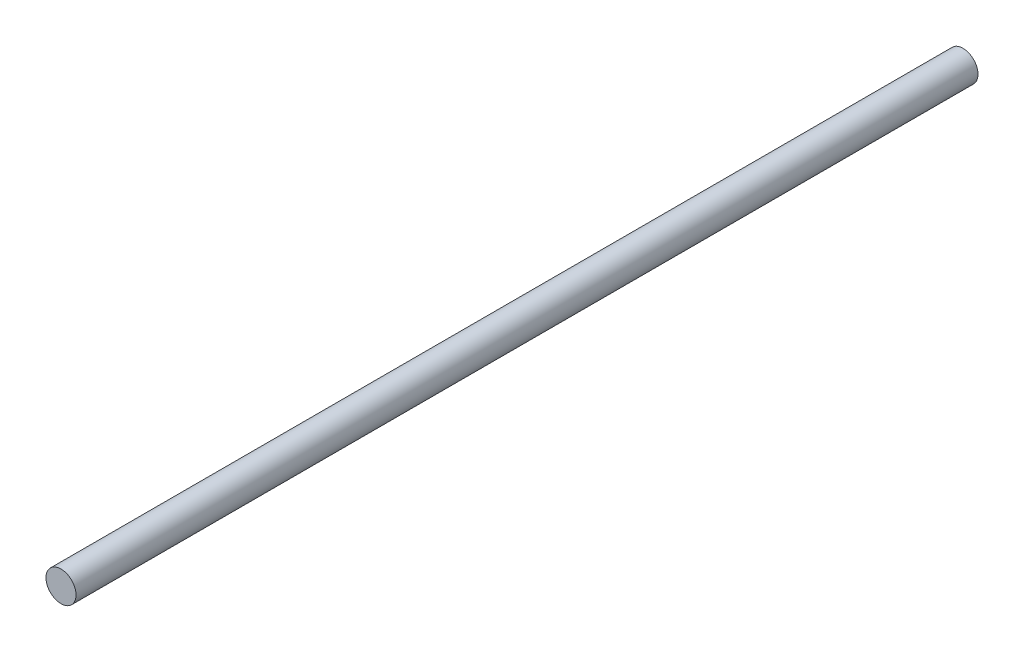
ISO-10303-21;
HEADER;
FILE_DESCRIPTION(('STEP AP214'),'2;1');
FILE_NAME('part.step','',(''),(''),'','','');
FILE_SCHEMA(('AUTOMOTIVE_DESIGN { 1 0 10303 214 1 1 1 1 }'));
ENDSEC;
DATA;
#1=APPLICATION_CONTEXT('core data for automotive mechanical design processes');
#2=APPLICATION_PROTOCOL_DEFINITION('international standard','automotive_design',2000,#1);
#3=PRODUCT_CONTEXT('',#1,'mechanical');
#4=PRODUCT('Part','Part','',(#3));
#5=PRODUCT_RELATED_PRODUCT_CATEGORY('part','',(#4));
#6=PRODUCT_DEFINITION_FORMATION('','',#4);
#7=PRODUCT_DEFINITION_CONTEXT('part definition',#1,'design');
#8=PRODUCT_DEFINITION('design','',#6,#7);
#9=PRODUCT_DEFINITION_SHAPE('','',#8);
#10=(LENGTH_UNIT() NAMED_UNIT(*) SI_UNIT(.MILLI.,.METRE.));
#11=(NAMED_UNIT(*) PLANE_ANGLE_UNIT() SI_UNIT($,.RADIAN.));
#12=(NAMED_UNIT(*) SI_UNIT($,.STERADIAN.) SOLID_ANGLE_UNIT());
#13=UNCERTAINTY_MEASURE_WITH_UNIT(LENGTH_MEASURE(1.E-05),#10,'distance_accuracy_value','');
#14=(GEOMETRIC_REPRESENTATION_CONTEXT(3) GLOBAL_UNCERTAINTY_ASSIGNED_CONTEXT((#13)) GLOBAL_UNIT_ASSIGNED_CONTEXT((#10,
#11,#12)) REPRESENTATION_CONTEXT('',''));
#15=CARTESIAN_POINT('',(0.,0.,0.));
#16=DIRECTION('',(0.,0.,1.));
#17=DIRECTION('',(1.,0.,0.));
#18=AXIS2_PLACEMENT_3D('',#15,#16,#17);
#19=CARTESIAN_POINT('',(0.,0.,1500.));
#20=DIRECTION('',(0.,0.,-1.));
#21=DIRECTION('',(-1.,0.,0.));
#22=AXIS2_PLACEMENT_3D('',#19,#20,#21);
#23=CYLINDRICAL_SURFACE('',#22,25.);
#24=CARTESIAN_POINT('',(0.,0.,1500.));
#25=DIRECTION('',(0.,0.,1.));
#26=DIRECTION('',(1.,0.,0.));
#27=AXIS2_PLACEMENT_3D('',#24,#25,#26);
#28=CIRCLE('',#27,25.);
#29=CARTESIAN_POINT('',(25.,0.,1500.));
#30=VERTEX_POINT('',#29);
#31=EDGE_CURVE('E10',#30,#30,#28,.T.);
#32=ORIENTED_EDGE('',*,*,#31,.F.);
#33=EDGE_LOOP('',(#32));
#34=FACE_BOUND('',#33,.T.);
#35=CARTESIAN_POINT('',(0.,0.,0.));
#36=DIRECTION('',(0.,0.,1.));
#37=DIRECTION('',(1.,0.,0.));
#38=AXIS2_PLACEMENT_3D('',#35,#36,#37);
#39=CIRCLE('',#38,25.);
#40=CARTESIAN_POINT('',(25.,0.,0.));
#41=VERTEX_POINT('',#40);
#42=EDGE_CURVE('E33',#41,#41,#39,.T.);
#43=ORIENTED_EDGE('',*,*,#42,.T.);
#44=EDGE_LOOP('',(#43));
#45=FACE_BOUND('',#44,.T.);
#46=ADVANCED_FACE('F30',(#34,#45),#23,.T.);
#47=CARTESIAN_POINT('',(0.,0.,1500.));
#48=DIRECTION('',(0.,0.,1.));
#49=DIRECTION('',(1.,0.,0.));
#50=AXIS2_PLACEMENT_3D('',#47,#48,#49);
#51=PLANE('',#50);
#52=ORIENTED_EDGE('',*,*,#31,.T.);
#53=EDGE_LOOP('',(#52));
#54=FACE_BOUND('',#53,.T.);
#55=ADVANCED_FACE('F45',(#54),#51,.T.);
#56=CARTESIAN_POINT('',(0.,0.,0.));
#57=DIRECTION('',(0.,0.,1.));
#58=DIRECTION('',(1.,0.,0.));
#59=AXIS2_PLACEMENT_3D('',#56,#57,#58);
#60=PLANE('',#59);
#61=ORIENTED_EDGE('',*,*,#42,.F.);
#62=EDGE_LOOP('',(#61));
#63=FACE_BOUND('',#62,.T.);
#64=ADVANCED_FACE('F43',(#63),#60,.F.);
#65=CLOSED_SHELL('',(#46,#55,#64));
#66=MANIFOLD_SOLID_BREP('B2',#65);
#67=ADVANCED_BREP_SHAPE_REPRESENTATION('',(#18,#66),#14);
#68=SHAPE_DEFINITION_REPRESENTATION(#9,#67);
ENDSEC;
END-ISO-10303-21;
